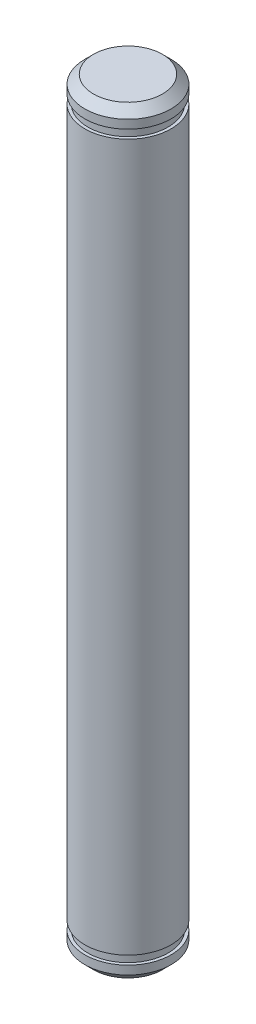
ISO-10303-21;
HEADER;
FILE_DESCRIPTION(('STEP AP214'),'2;1');
FILE_NAME('part.step','',(''),(''),'','','');
FILE_SCHEMA(('AUTOMOTIVE_DESIGN { 1 0 10303 214 1 1 1 1 }'));
ENDSEC;
DATA;
#1=APPLICATION_CONTEXT('core data for automotive mechanical design processes');
#2=APPLICATION_PROTOCOL_DEFINITION('international standard','automotive_design',2000,#1);
#3=PRODUCT_CONTEXT('',#1,'mechanical');
#4=PRODUCT('Part','Part','',(#3));
#5=PRODUCT_RELATED_PRODUCT_CATEGORY('part','',(#4));
#6=PRODUCT_DEFINITION_FORMATION('','',#4);
#7=PRODUCT_DEFINITION_CONTEXT('part definition',#1,'design');
#8=PRODUCT_DEFINITION('design','',#6,#7);
#9=PRODUCT_DEFINITION_SHAPE('','',#8);
#10=(LENGTH_UNIT() NAMED_UNIT(*) SI_UNIT(.MILLI.,.METRE.));
#11=(NAMED_UNIT(*) PLANE_ANGLE_UNIT() SI_UNIT($,.RADIAN.));
#12=(NAMED_UNIT(*) SI_UNIT($,.STERADIAN.) SOLID_ANGLE_UNIT());
#13=UNCERTAINTY_MEASURE_WITH_UNIT(LENGTH_MEASURE(1.E-05),#10,'distance_accuracy_value','');
#14=(GEOMETRIC_REPRESENTATION_CONTEXT(3) GLOBAL_UNCERTAINTY_ASSIGNED_CONTEXT((#13)) GLOBAL_UNIT_ASSIGNED_CONTEXT((#10,
#11,#12)) REPRESENTATION_CONTEXT('',''));
#15=CARTESIAN_POINT('',(0.,0.,0.));
#16=DIRECTION('',(0.,0.,1.));
#17=DIRECTION('',(1.,0.,0.));
#18=AXIS2_PLACEMENT_3D('',#15,#16,#17);
#19=CARTESIAN_POINT('',(0.,44.,0.));
#20=DIRECTION('',(0.,1.,0.));
#21=DIRECTION('',(-1.,0.,0.));
#22=AXIS2_PLACEMENT_3D('',#19,#20,#21);
#23=CYLINDRICAL_SURFACE('',#22,5.);
#24=CARTESIAN_POINT('',(0.,41.,0.));
#25=DIRECTION('',(0.,1.,0.));
#26=DIRECTION('',(-1.,0.,0.));
#27=AXIS2_PLACEMENT_3D('',#24,#25,#26);
#28=CIRCLE('',#27,5.);
#29=CARTESIAN_POINT('',(-4.99999999999999,41.,0.));
#30=VERTEX_POINT('',#29);
#31=EDGE_CURVE('E57',#30,#30,#28,.T.);
#32=ORIENTED_EDGE('',*,*,#31,.F.);
#33=EDGE_LOOP('',(#32));
#34=FACE_BOUND('',#33,.T.);
#35=CARTESIAN_POINT('',(0.,-41.,0.));
#36=DIRECTION('',(0.,1.,0.));
#37=DIRECTION('',(-1.,0.,0.));
#38=AXIS2_PLACEMENT_3D('',#35,#36,#37);
#39=CIRCLE('',#38,5.);
#40=CARTESIAN_POINT('',(-4.99999999999998,-41.,0.));
#41=VERTEX_POINT('',#40);
#42=EDGE_CURVE('E69',#41,#41,#39,.T.);
#43=ORIENTED_EDGE('',*,*,#42,.T.);
#44=EDGE_LOOP('',(#43));
#45=FACE_BOUND('',#44,.T.);
#46=ADVANCED_FACE('F35',(#34,#45),#23,.T.);
#47=CARTESIAN_POINT('',(0.,44.,0.));
#48=DIRECTION('',(0.,-1.,0.));
#49=DIRECTION('',(1.,0.,0.));
#50=AXIS2_PLACEMENT_3D('',#47,#48,#49);
#51=PLANE('',#50);
#52=CARTESIAN_POINT('',(0.,44.,0.));
#53=DIRECTION('',(0.,-1.,0.));
#54=DIRECTION('',(1.,0.,0.));
#55=AXIS2_PLACEMENT_3D('',#52,#53,#54);
#56=CIRCLE('',#55,4.00000000000002);
#57=CARTESIAN_POINT('',(4.00000000000002,44.,0.));
#58=VERTEX_POINT('',#57);
#59=EDGE_CURVE('E10',#58,#58,#56,.F.);
#60=ORIENTED_EDGE('',*,*,#59,.T.);
#61=EDGE_LOOP('',(#60));
#62=FACE_BOUND('',#61,.T.);
#63=ADVANCED_FACE('F111',(#62),#51,.F.);
#64=CARTESIAN_POINT('',(0.,42.,0.));
#65=DIRECTION('',(0.,1.,0.));
#66=DIRECTION('',(-1.,0.,0.));
#67=AXIS2_PLACEMENT_3D('',#64,#65,#66);
#68=CIRCLE('',#67,5.);
#69=CARTESIAN_POINT('',(-4.99999999999999,42.,0.));
#70=VERTEX_POINT('',#69);
#71=EDGE_CURVE('E56',#70,#70,#68,.T.);
#72=ORIENTED_EDGE('',*,*,#71,.T.);
#73=EDGE_LOOP('',(#72));
#74=FACE_BOUND('',#73,.T.);
#75=CARTESIAN_POINT('',(0.,43.,0.));
#76=DIRECTION('',(0.,-1.,0.));
#77=DIRECTION('',(1.,0.,0.));
#78=AXIS2_PLACEMENT_3D('',#75,#76,#77);
#79=CIRCLE('',#78,5.);
#80=CARTESIAN_POINT('',(5.,43.,0.));
#81=VERTEX_POINT('',#80);
#82=EDGE_CURVE('E51',#81,#81,#79,.T.);
#83=ORIENTED_EDGE('',*,*,#82,.T.);
#84=EDGE_LOOP('',(#83));
#85=FACE_BOUND('',#84,.T.);
#86=ADVANCED_FACE('F97',(#74,#85),#23,.T.);
#87=CARTESIAN_POINT('',(0.,44.,0.));
#88=DIRECTION('',(0.,-1.,0.));
#89=DIRECTION('',(1.,0.,0.));
#90=AXIS2_PLACEMENT_3D('',#87,#88,#89);
#91=CONICAL_SURFACE('',#90,4.00000000000002,0.785398163397451);
#92=ORIENTED_EDGE('',*,*,#82,.F.);
#93=EDGE_LOOP('',(#92));
#94=FACE_BOUND('',#93,.T.);
#95=ORIENTED_EDGE('',*,*,#59,.F.);
#96=EDGE_LOOP('',(#95));
#97=FACE_BOUND('',#96,.T.);
#98=ADVANCED_FACE('F38',(#94,#97),#91,.T.);
#99=CARTESIAN_POINT('',(0.,42.,0.));
#100=DIRECTION('',(0.,1.,0.));
#101=DIRECTION('',(-1.,0.,0.));
#102=AXIS2_PLACEMENT_3D('',#99,#100,#101);
#103=PLANE('',#102);
#104=ORIENTED_EDGE('',*,*,#71,.F.);
#105=EDGE_LOOP('',(#104));
#106=FACE_BOUND('',#105,.T.);
#107=CARTESIAN_POINT('',(0.,42.,0.));
#108=DIRECTION('',(0.,1.,0.));
#109=DIRECTION('',(-1.,0.,0.));
#110=AXIS2_PLACEMENT_3D('',#107,#108,#109);
#111=CIRCLE('',#110,4.65);
#112=CARTESIAN_POINT('',(-4.65,42.,0.));
#113=VERTEX_POINT('',#112);
#114=EDGE_CURVE('E60',#113,#113,#111,.T.);
#115=ORIENTED_EDGE('',*,*,#114,.T.);
#116=EDGE_LOOP('',(#115));
#117=FACE_BOUND('',#116,.T.);
#118=ADVANCED_FACE('F126',(#106,#117),#103,.F.);
#119=CARTESIAN_POINT('',(0.,41.,0.));
#120=DIRECTION('',(0.,1.,0.));
#121=DIRECTION('',(-1.,0.,0.));
#122=AXIS2_PLACEMENT_3D('',#119,#120,#121);
#123=PLANE('',#122);
#124=ORIENTED_EDGE('',*,*,#31,.T.);
#125=EDGE_LOOP('',(#124));
#126=FACE_BOUND('',#125,.T.);
#127=CARTESIAN_POINT('',(0.,41.,0.));
#128=DIRECTION('',(0.,1.,0.));
#129=DIRECTION('',(-1.,0.,0.));
#130=AXIS2_PLACEMENT_3D('',#127,#128,#129);
#131=CIRCLE('',#130,4.65);
#132=CARTESIAN_POINT('',(-4.65,41.,0.));
#133=VERTEX_POINT('',#132);
#134=EDGE_CURVE('E63',#133,#133,#131,.T.);
#135=ORIENTED_EDGE('',*,*,#134,.F.);
#136=EDGE_LOOP('',(#135));
#137=FACE_BOUND('',#136,.T.);
#138=ADVANCED_FACE('F135',(#126,#137),#123,.T.);
#139=CARTESIAN_POINT('',(0.,42.,0.));
#140=DIRECTION('',(0.,-1.,0.));
#141=DIRECTION('',(1.,0.,0.));
#142=AXIS2_PLACEMENT_3D('',#139,#140,#141);
#143=CYLINDRICAL_SURFACE('',#142,4.65);
#144=ORIENTED_EDGE('',*,*,#114,.F.);
#145=EDGE_LOOP('',(#144));
#146=FACE_BOUND('',#145,.T.);
#147=ORIENTED_EDGE('',*,*,#134,.T.);
#148=EDGE_LOOP('',(#147));
#149=FACE_BOUND('',#148,.T.);
#150=ADVANCED_FACE('F88',(#146,#149),#143,.T.);
#151=CARTESIAN_POINT('',(0.,-42.,0.));
#152=DIRECTION('',(0.,-1.,0.));
#153=DIRECTION('',(-1.,0.,0.));
#154=AXIS2_PLACEMENT_3D('',#151,#152,#153);
#155=PLANE('',#154);
#156=CARTESIAN_POINT('',(0.,-42.,0.));
#157=DIRECTION('',(0.,1.,0.));
#158=DIRECTION('',(-1.,0.,0.));
#159=AXIS2_PLACEMENT_3D('',#156,#157,#158);
#160=CIRCLE('',#159,4.65);
#161=CARTESIAN_POINT('',(-4.64999999999999,-42.,0.));
#162=VERTEX_POINT('',#161);
#163=EDGE_CURVE('E72',#162,#162,#160,.T.);
#164=ORIENTED_EDGE('',*,*,#163,.F.);
#165=EDGE_LOOP('',(#164));
#166=FACE_BOUND('',#165,.T.);
#167=CARTESIAN_POINT('',(0.,-42.,0.));
#168=DIRECTION('',(0.,1.,0.));
#169=DIRECTION('',(-1.,0.,0.));
#170=AXIS2_PLACEMENT_3D('',#167,#168,#169);
#171=CIRCLE('',#170,5.);
#172=CARTESIAN_POINT('',(-4.99999999999998,-42.,0.));
#173=VERTEX_POINT('',#172);
#174=EDGE_CURVE('E66',#173,#173,#171,.T.);
#175=ORIENTED_EDGE('',*,*,#174,.T.);
#176=EDGE_LOOP('',(#175));
#177=FACE_BOUND('',#176,.T.);
#178=ADVANCED_FACE('F84',(#166,#177),#155,.F.);
#179=CARTESIAN_POINT('',(0.,-41.,0.));
#180=DIRECTION('',(0.,-1.,0.));
#181=DIRECTION('',(-1.,0.,0.));
#182=AXIS2_PLACEMENT_3D('',#179,#180,#181);
#183=PLANE('',#182);
#184=CARTESIAN_POINT('',(0.,-41.,0.));
#185=DIRECTION('',(0.,1.,0.));
#186=DIRECTION('',(-1.,0.,0.));
#187=AXIS2_PLACEMENT_3D('',#184,#185,#186);
#188=CIRCLE('',#187,4.65);
#189=CARTESIAN_POINT('',(-4.64999999999999,-41.,0.));
#190=VERTEX_POINT('',#189);
#191=EDGE_CURVE('E75',#190,#190,#188,.T.);
#192=ORIENTED_EDGE('',*,*,#191,.T.);
#193=EDGE_LOOP('',(#192));
#194=FACE_BOUND('',#193,.T.);
#195=ORIENTED_EDGE('',*,*,#42,.F.);
#196=EDGE_LOOP('',(#195));
#197=FACE_BOUND('',#196,.T.);
#198=ADVANCED_FACE('F87',(#194,#197),#183,.T.);
#199=CARTESIAN_POINT('',(0.,-42.,0.));
#200=DIRECTION('',(0.,1.,0.));
#201=DIRECTION('',(-1.,0.,0.));
#202=AXIS2_PLACEMENT_3D('',#199,#200,#201);
#203=CYLINDRICAL_SURFACE('',#202,4.65);
#204=ORIENTED_EDGE('',*,*,#163,.T.);
#205=EDGE_LOOP('',(#204));
#206=FACE_BOUND('',#205,.T.);
#207=ORIENTED_EDGE('',*,*,#191,.F.);
#208=EDGE_LOOP('',(#207));
#209=FACE_BOUND('',#208,.T.);
#210=ADVANCED_FACE('F81',(#206,#209),#203,.T.);
#211=CARTESIAN_POINT('',(5.,-44.,0.));
#212=DIRECTION('',(0.,1.,0.));
#213=DIRECTION('',(-1.,0.,0.));
#214=AXIS2_PLACEMENT_3D('',#211,#212,#213);
#215=PLANE('',#214);
#216=CARTESIAN_POINT('',(0.,-44.,0.));
#217=DIRECTION('',(0.,1.,0.));
#218=DIRECTION('',(-1.,0.,0.));
#219=AXIS2_PLACEMENT_3D('',#216,#217,#218);
#220=CIRCLE('',#219,3.99999999999997);
#221=CARTESIAN_POINT('',(-3.99999999999995,-44.,0.));
#222=VERTEX_POINT('',#221);
#223=EDGE_CURVE('E43',#222,#222,#220,.F.);
#224=ORIENTED_EDGE('',*,*,#223,.T.);
#225=EDGE_LOOP('',(#224));
#226=FACE_BOUND('',#225,.T.);
#227=ADVANCED_FACE('F101',(#226),#215,.F.);
#228=CARTESIAN_POINT('',(0.,-43.,0.));
#229=DIRECTION('',(0.,1.,0.));
#230=DIRECTION('',(-1.,0.,0.));
#231=AXIS2_PLACEMENT_3D('',#228,#229,#230);
#232=CONICAL_SURFACE('',#231,5.,0.785398163397455);
#233=ORIENTED_EDGE('',*,*,#223,.F.);
#234=EDGE_LOOP('',(#233));
#235=FACE_BOUND('',#234,.T.);
#236=CARTESIAN_POINT('',(0.,-43.,0.));
#237=DIRECTION('',(0.,1.,0.));
#238=DIRECTION('',(-1.,0.,0.));
#239=AXIS2_PLACEMENT_3D('',#236,#237,#238);
#240=CIRCLE('',#239,5.);
#241=CARTESIAN_POINT('',(-4.99999999999998,-43.,0.));
#242=VERTEX_POINT('',#241);
#243=EDGE_CURVE('E47',#242,#242,#240,.T.);
#244=ORIENTED_EDGE('',*,*,#243,.F.);
#245=EDGE_LOOP('',(#244));
#246=FACE_BOUND('',#245,.T.);
#247=ADVANCED_FACE('F95',(#235,#246),#232,.T.);
#248=ORIENTED_EDGE('',*,*,#174,.F.);
#249=EDGE_LOOP('',(#248));
#250=FACE_BOUND('',#249,.T.);
#251=ORIENTED_EDGE('',*,*,#243,.T.);
#252=EDGE_LOOP('',(#251));
#253=FACE_BOUND('',#252,.T.);
#254=ADVANCED_FACE('F92',(#250,#253),#23,.T.);
#255=CLOSED_SHELL('',(#46,#63,#86,#98,#118,#138,#150,#178,#198,#210,#227,#247,#254));
#256=MANIFOLD_SOLID_BREP('B2',#255);
#257=ADVANCED_BREP_SHAPE_REPRESENTATION('',(#18,#256),#14);
#258=SHAPE_DEFINITION_REPRESENTATION(#9,#257);
ENDSEC;
END-ISO-10303-21;
